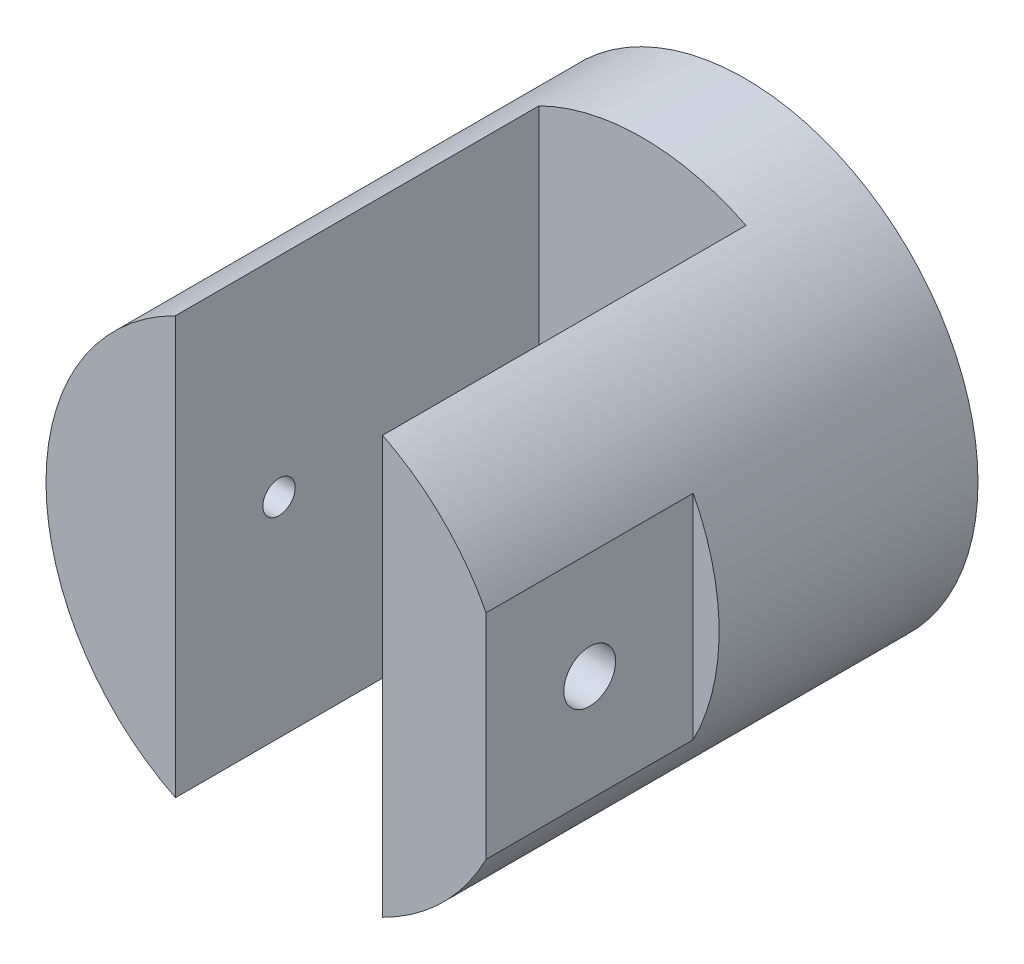
ISO-10303-21;
HEADER;
FILE_DESCRIPTION(('STEP AP214'),'2;1');
FILE_NAME('part.step','',(''),(''),'','','');
FILE_SCHEMA(('AUTOMOTIVE_DESIGN { 1 0 10303 214 1 1 1 1 }'));
ENDSEC;
DATA;
#1=APPLICATION_CONTEXT('core data for automotive mechanical design processes');
#2=APPLICATION_PROTOCOL_DEFINITION('international standard','automotive_design',2000,#1);
#3=PRODUCT_CONTEXT('',#1,'mechanical');
#4=PRODUCT('Part','Part','',(#3));
#5=PRODUCT_RELATED_PRODUCT_CATEGORY('part','',(#4));
#6=PRODUCT_DEFINITION_FORMATION('','',#4);
#7=PRODUCT_DEFINITION_CONTEXT('part definition',#1,'design');
#8=PRODUCT_DEFINITION('design','',#6,#7);
#9=PRODUCT_DEFINITION_SHAPE('','',#8);
#10=(LENGTH_UNIT() NAMED_UNIT(*) SI_UNIT(.MILLI.,.METRE.));
#11=(NAMED_UNIT(*) PLANE_ANGLE_UNIT() SI_UNIT($,.RADIAN.));
#12=(NAMED_UNIT(*) SI_UNIT($,.STERADIAN.) SOLID_ANGLE_UNIT());
#13=UNCERTAINTY_MEASURE_WITH_UNIT(LENGTH_MEASURE(1.E-05),#10,'distance_accuracy_value','');
#14=(GEOMETRIC_REPRESENTATION_CONTEXT(3) GLOBAL_UNCERTAINTY_ASSIGNED_CONTEXT((#13)) GLOBAL_UNIT_ASSIGNED_CONTEXT((#10,
#11,#12)) REPRESENTATION_CONTEXT('',''));
#15=CARTESIAN_POINT('',(0.,0.,0.));
#16=DIRECTION('',(0.,0.,1.));
#17=DIRECTION('',(1.,0.,0.));
#18=AXIS2_PLACEMENT_3D('',#15,#16,#17);
#19=CARTESIAN_POINT('',(0.,0.,57.15));
#20=DIRECTION('',(0.,0.,1.));
#21=DIRECTION('',(1.,0.,0.));
#22=AXIS2_PLACEMENT_3D('',#19,#20,#21);
#23=PLANE('',#22);
#24=CARTESIAN_POINT('',(0.,0.,57.15));
#25=DIRECTION('',(0.,0.,1.));
#26=DIRECTION('',(1.,0.,0.));
#27=AXIS2_PLACEMENT_3D('',#24,#25,#26);
#28=CIRCLE('',#27,28.575);
#29=CARTESIAN_POINT('',(12.7,-25.5976683508479,57.15));
#30=VERTEX_POINT('',#29);
#31=CARTESIAN_POINT('',(25.4,-13.0908603613361,57.15));
#32=VERTEX_POINT('',#31);
#33=EDGE_CURVE('E99',#30,#32,#28,.T.);
#34=ORIENTED_EDGE('',*,*,#33,.T.);
#35=DIRECTION('',(0.,1.,0.));
#36=VECTOR('',#35,1.);
#37=CARTESIAN_POINT('',(25.4,-25.5976683508479,57.15));
#38=LINE('',#37,#36);
#39=CARTESIAN_POINT('',(25.4,13.0908603613361,57.15));
#40=VERTEX_POINT('',#39);
#41=EDGE_CURVE('E86',#32,#40,#38,.T.);
#42=ORIENTED_EDGE('',*,*,#41,.T.);
#43=CARTESIAN_POINT('',(12.7,25.5976683508479,57.15));
#44=VERTEX_POINT('',#43);
#45=EDGE_CURVE('E105',#40,#44,#28,.T.);
#46=ORIENTED_EDGE('',*,*,#45,.T.);
#47=DIRECTION('',(0.,1.,0.));
#48=VECTOR('',#47,1.);
#49=CARTESIAN_POINT('',(12.7,0.,57.15));
#50=LINE('',#49,#48);
#51=EDGE_CURVE('E103',#30,#44,#50,.T.);
#52=ORIENTED_EDGE('',*,*,#51,.F.);
#53=EDGE_LOOP('',(#34,#42,#46,#52));
#54=FACE_BOUND('',#53,.T.);
#55=ADVANCED_FACE('F34',(#54),#23,.T.);
#56=CARTESIAN_POINT('',(0.,0.,57.15));
#57=DIRECTION('',(0.,0.,-1.));
#58=DIRECTION('',(-1.,0.,0.));
#59=AXIS2_PLACEMENT_3D('',#56,#57,#58);
#60=CYLINDRICAL_SURFACE('',#59,28.575);
#61=CARTESIAN_POINT('',(-28.575,0.,42.465625));
#62=CARTESIAN_POINT('',(-28.574999087953,0.111319299507645,42.4656298877848));
#63=CARTESIAN_POINT('',(-28.574342551963,0.222715892217428,42.4750236571586));
#64=CARTESIAN_POINT('',(-28.5717866196945,0.442431292671023,42.5123613819981));
#65=CARTESIAN_POINT('',(-28.5698857884811,0.550746396142106,42.5403267549819));
#66=CARTESIAN_POINT('',(-28.5650562309021,0.761084554485153,42.6139989227208));
#67=CARTESIAN_POINT('',(-28.5621280587557,0.863110967093981,42.6596961530836));
#68=CARTESIAN_POINT('',(-28.5555728670619,1.05801915420526,42.7675188522542));
#69=CARTESIAN_POINT('',(-28.551946004417,1.15090297476537,42.8296406338216));
#70=CARTESIAN_POINT('',(-28.5443935353041,1.32508394520094,42.9686718635007));
#71=CARTESIAN_POINT('',(-28.540467458915,1.40636226830162,43.0456048746165));
#72=CARTESIAN_POINT('',(-28.5327630432362,1.55486383992128,43.2120256397658));
#73=CARTESIAN_POINT('',(-28.5289847102184,1.62208649227941,43.3015139260531));
#74=CARTESIAN_POINT('',(-28.5219981541791,1.7406288148697,43.4906145557175));
#75=CARTESIAN_POINT('',(-28.5187905060806,1.79193248617025,43.5902369514768));
#76=CARTESIAN_POINT('',(-28.5133132635222,1.87707822897832,43.7967075523057));
#77=CARTESIAN_POINT('',(-28.5110436570288,1.91092052448609,43.9035556646615));
#78=CARTESIAN_POINT('',(-28.5077030009998,1.96012965963794,44.1212603160706));
#79=CARTESIAN_POINT('',(-28.506630007008,1.97552647561386,44.2321100490668));
#80=CARTESIAN_POINT('',(-28.5057977607184,1.98750015203671,44.4548253808133));
#81=CARTESIAN_POINT('',(-28.5060384905973,1.98407726780781,44.5666909657611));
#82=CARTESIAN_POINT('',(-28.5078047405347,1.95853354607668,44.7880579421178));
#83=CARTESIAN_POINT('',(-28.5093280288421,1.93644518769991,44.8975631016054));
#84=CARTESIAN_POINT('',(-28.5134842307626,1.87424792821694,45.1113077379459));
#85=CARTESIAN_POINT('',(-28.5161171522939,1.8341388985155,45.2155471772168));
#86=CARTESIAN_POINT('',(-28.5221984940563,1.73700212480837,45.415905497171));
#87=CARTESIAN_POINT('',(-28.5256476215771,1.67995969606262,45.5120172361306));
#88=CARTESIAN_POINT('',(-28.5329720138736,1.55058597118954,45.6933138147834));
#89=CARTESIAN_POINT('',(-28.5368472845997,1.47825446156546,45.7784985018646));
#90=CARTESIAN_POINT('',(-28.544597188435,1.32017310339922,45.9357118280196));
#91=CARTESIAN_POINT('',(-28.5484718028046,1.23439515545463,46.007712216499));
#92=CARTESIAN_POINT('',(-28.5557759079867,1.05195420334755,46.1362950541471));
#93=CARTESIAN_POINT('',(-28.559205398607,0.955291194485443,46.192877496659));
#94=CARTESIAN_POINT('',(-28.5652331981767,0.753806520907827,46.2890160754282));
#95=CARTESIAN_POINT('',(-28.5678314522194,0.648984317811049,46.3285710870105));
#96=CARTESIAN_POINT('',(-28.5719033065064,0.434164658178538,46.389512837987));
#97=CARTESIAN_POINT('',(-28.5733769229605,0.324167276258219,46.4108998392419));
#98=CARTESIAN_POINT('',(-28.5750313709088,0.102364718092508,46.4348633408994));
#99=CARTESIAN_POINT('',(-28.5752148860092,-0.00943622030672792,46.4374788890049));
#100=CARTESIAN_POINT('',(-28.5742755997621,-0.231887663287669,46.4239273443557));
#101=CARTESIAN_POINT('',(-28.5731528068323,-0.342538175278037,46.4077603726347));
#102=CARTESIAN_POINT('',(-28.5697289900858,-0.559437401378969,46.3571350506591));
#103=CARTESIAN_POINT('',(-28.5674291239248,-0.665690329757746,46.322694671147));
#104=CARTESIAN_POINT('',(-28.5619097845244,-0.87090847491883,46.2365184513664));
#105=CARTESIAN_POINT('',(-28.5586903010998,-0.969873610970421,46.1847824195399));
#106=CARTESIAN_POINT('',(-28.5516865290548,-1.15788539449078,46.065384473408));
#107=CARTESIAN_POINT('',(-28.5479013215336,-1.2469154858185,45.997696543437));
#108=CARTESIAN_POINT('',(-28.5401949613887,-1.41236313815245,45.8483539928909));
#109=CARTESIAN_POINT('',(-28.5362738071205,-1.48878054652832,45.7666992033225));
#110=CARTESIAN_POINT('',(-28.5287296627141,-1.62696640272635,45.5915720482555));
#111=CARTESIAN_POINT('',(-28.5251071960819,-1.68870947308748,45.498079632774));
#112=CARTESIAN_POINT('',(-28.5185773462006,-1.79562028380937,45.3020316028401));
#113=CARTESIAN_POINT('',(-28.5156699577079,-1.84078814571672,45.1994760548547));
#114=CARTESIAN_POINT('',(-28.5109019440666,-1.91322265822302,44.9883047713957));
#115=CARTESIAN_POINT('',(-28.5090403928892,-1.94050514887296,44.8796944910196));
#116=CARTESIAN_POINT('',(-28.506571438514,-1.97644615433683,44.6594213441718));
#117=CARTESIAN_POINT('',(-28.5059640193778,-1.98510490583367,44.5477585165121));
#118=CARTESIAN_POINT('',(-28.5060722212008,-1.98355024488174,44.3248022428108));
#119=CARTESIAN_POINT('',(-28.5067850458043,-1.97337672035081,44.2135085150856));
#120=CARTESIAN_POINT('',(-28.509447483139,-1.93452914122231,43.9942138386027));
#121=CARTESIAN_POINT('',(-28.5113970980188,-1.90585505448336,43.8862128955658));
#122=CARTESIAN_POINT('',(-28.5163127220648,-1.83082966284671,43.6765646525717));
#123=CARTESIAN_POINT('',(-28.5192787110915,-1.78447870821198,43.5749172267675));
#124=CARTESIAN_POINT('',(-28.5258928497638,-1.67542036739642,43.3808412889753));
#125=CARTESIAN_POINT('',(-28.5295409838508,-1.61271335425529,43.2884125667988));
#126=CARTESIAN_POINT('',(-28.5371174121709,-1.47257422976607,43.1151946079687));
#127=CARTESIAN_POINT('',(-28.5410462512,-1.39511296983274,43.0344289778683));
#128=CARTESIAN_POINT('',(-28.5487365746652,-1.22770934371807,42.8870177367506));
#129=CARTESIAN_POINT('',(-28.5524980180627,-1.13776393894668,42.8203755733364));
#130=CARTESIAN_POINT('',(-28.559434468147,-0.947821756099757,42.7030419960044));
#131=CARTESIAN_POINT('',(-28.5626086330706,-0.847810862841548,42.6523734054108));
#132=CARTESIAN_POINT('',(-28.5680021177587,-0.640750638508975,42.5686102494963));
#133=CARTESIAN_POINT('',(-28.5702225490045,-0.533709669007892,42.5354952166582));
#134=CARTESIAN_POINT('',(-28.5728800673192,-0.355017261798307,42.4963340243912));
#135=CARTESIAN_POINT('',(-28.5736714832197,-0.284519210892245,42.4848331555658));
#136=CARTESIAN_POINT('',(-28.5747317414387,-0.142691360205758,42.4694770833858));
#137=CARTESIAN_POINT('',(-28.5750005846704,-0.0713615618789448,42.4656218666713));
#138=CARTESIAN_POINT('',(-28.575,0.,42.465625));
#139=B_SPLINE_CURVE_WITH_KNOTS('',3,(#61,#62,#63,#64,#65,#66,#67,#68,#69,#70,#71,#72,#73,#74,
#75,#76,#77,#78,#79,#80,#81,#82,#83,#84,#85,#86,#87,#88,#89,#90,#91,#92,#93,#94,#95,#96,#97,#98,
#99,#100,#101,#102,#103,#104,#105,#106,#107,#108,#109,#110,#111,#112,#113,#114,#115,#116,#117,
#118,#119,#120,#121,#122,#123,#124,#125,#126,#127,#128,#129,#130,#131,#132,#133,#134,#135,#136,
#137,#138),.UNSPECIFIED.,.T.,.F.,(4,2,2,2,2,2,2,2,2,2,2,2,2,2,2,2,2,2,2,2,2,2,2,2,2,2,2,2,2,2,2,
2,2,2,2,2,2,2,4),(0.,0.333697375898876,0.667780254837741,1.00168318263904,1.33551121424018,
1.6698747841483,2.0042525329636,2.33896525847292,2.67367369007098,3.00783743532058,
3.34199664702969,3.67557559469445,4.00915692281119,4.34302838386973,4.67690450741815,
5.01148787823042,5.3460713934992,5.68067700487739,6.01527779340976,6.34918235512075,
6.68308476517682,7.01665941028769,7.35023775002504,7.68436392818889,8.01849414943063,
8.35319807025538,8.68789953663544,9.02230417515375,9.35670456380953,9.69039748217925,
10.0240909802814,10.357777866669,10.6914571431809,11.0258026075465,11.3602295934113,
11.6951322712522,12.029643587471,12.2435616381192,12.4574793149674),.UNSPECIFIED.);
#140=CARTESIAN_POINT('',(-28.575,0.,42.465625));
#141=VERTEX_POINT('',#140);
#142=EDGE_CURVE('E188',#141,#141,#139,.T.);
#143=ORIENTED_EDGE('',*,*,#142,.T.);
#144=EDGE_LOOP('',(#143));
#145=FACE_BOUND('',#144,.T.);
#146=CARTESIAN_POINT('',(0.,0.,0.));
#147=DIRECTION('',(0.,0.,1.));
#148=DIRECTION('',(1.,0.,0.));
#149=AXIS2_PLACEMENT_3D('',#146,#147,#148);
#150=CIRCLE('',#149,28.575);
#151=CARTESIAN_POINT('',(28.575,0.,0.));
#152=VERTEX_POINT('',#151);
#153=EDGE_CURVE('E108',#152,#152,#150,.T.);
#154=ORIENTED_EDGE('',*,*,#153,.T.);
#155=EDGE_LOOP('',(#154));
#156=FACE_BOUND('',#155,.T.);
#157=DIRECTION('',(0.,0.,-1.));
#158=VECTOR('',#157,1.);
#159=CARTESIAN_POINT('',(25.4,-13.0908603613361,57.15));
#160=LINE('',#159,#158);
#161=CARTESIAN_POINT('',(25.4,-13.0908603613361,31.75));
#162=VERTEX_POINT('',#161);
#163=EDGE_CURVE('E13',#32,#162,#160,.T.);
#164=ORIENTED_EDGE('',*,*,#163,.F.);
#165=ORIENTED_EDGE('',*,*,#33,.F.);
#166=DIRECTION('',(0.,0.,-1.));
#167=VECTOR('',#166,1.);
#168=CARTESIAN_POINT('',(12.7,-25.5976683508479,57.15));
#169=LINE('',#168,#167);
#170=CARTESIAN_POINT('',(12.7,-25.5976683508479,12.573));
#171=VERTEX_POINT('',#170);
#172=EDGE_CURVE('E111',#30,#171,#169,.T.);
#173=ORIENTED_EDGE('',*,*,#172,.T.);
#174=CARTESIAN_POINT('',(0.,0.,12.573));
#175=DIRECTION('',(0.,0.,-1.));
#176=DIRECTION('',(-1.,0.,0.));
#177=AXIS2_PLACEMENT_3D('',#174,#175,#176);
#178=CIRCLE('',#177,28.575);
#179=CARTESIAN_POINT('',(-12.7,-25.5976683508479,12.573));
#180=VERTEX_POINT('',#179);
#181=EDGE_CURVE('E117',#171,#180,#178,.T.);
#182=ORIENTED_EDGE('',*,*,#181,.T.);
#183=DIRECTION('',(0.,0.,-1.));
#184=VECTOR('',#183,1.);
#185=CARTESIAN_POINT('',(-12.7,-25.5976683508479,57.15));
#186=LINE('',#185,#184);
#187=CARTESIAN_POINT('',(-12.7,-25.5976683508479,57.15));
#188=VERTEX_POINT('',#187);
#189=EDGE_CURVE('E134',#180,#188,#186,.F.);
#190=ORIENTED_EDGE('',*,*,#189,.T.);
#191=CARTESIAN_POINT('',(-12.7,25.5976683508479,57.15));
#192=VERTEX_POINT('',#191);
#193=EDGE_CURVE('E104',#192,#188,#28,.T.);
#194=ORIENTED_EDGE('',*,*,#193,.F.);
#195=DIRECTION('',(0.,0.,-1.));
#196=VECTOR('',#195,1.);
#197=CARTESIAN_POINT('',(-12.7,25.5976683508479,57.15));
#198=LINE('',#197,#196);
#199=CARTESIAN_POINT('',(-12.7,25.5976683508479,12.573));
#200=VERTEX_POINT('',#199);
#201=EDGE_CURVE('E57',#192,#200,#198,.T.);
#202=ORIENTED_EDGE('',*,*,#201,.T.);
#203=CARTESIAN_POINT('',(12.7,25.5976683508479,12.573));
#204=VERTEX_POINT('',#203);
#205=EDGE_CURVE('E119',#200,#204,#178,.T.);
#206=ORIENTED_EDGE('',*,*,#205,.T.);
#207=DIRECTION('',(0.,0.,-1.));
#208=VECTOR('',#207,1.);
#209=CARTESIAN_POINT('',(12.7,25.5976683508479,57.15));
#210=LINE('',#209,#208);
#211=EDGE_CURVE('E122',#204,#44,#210,.F.);
#212=ORIENTED_EDGE('',*,*,#211,.T.);
#213=ORIENTED_EDGE('',*,*,#45,.F.);
#214=DIRECTION('',(0.,0.,-1.));
#215=VECTOR('',#214,1.);
#216=CARTESIAN_POINT('',(25.4,13.0908603613361,57.15));
#217=LINE('',#216,#215);
#218=CARTESIAN_POINT('',(25.4,13.0908603613361,31.75));
#219=VERTEX_POINT('',#218);
#220=EDGE_CURVE('E43',#219,#40,#217,.F.);
#221=ORIENTED_EDGE('',*,*,#220,.F.);
#222=CARTESIAN_POINT('',(0.,0.,31.75));
#223=DIRECTION('',(0.,0.,1.));
#224=DIRECTION('',(1.,0.,0.));
#225=AXIS2_PLACEMENT_3D('',#222,#223,#224);
#226=CIRCLE('',#225,28.575);
#227=EDGE_CURVE('E100',#162,#219,#226,.T.);
#228=ORIENTED_EDGE('',*,*,#227,.F.);
#229=EDGE_LOOP('',(#164,#165,#173,#182,#190,#194,#202,#206,#212,#213,#221,#228));
#230=FACE_BOUND('',#229,.T.);
#231=ADVANCED_FACE('F36',(#145,#156,#230),#60,.T.);
#232=DIRECTION('',(0.,-1.,0.));
#233=VECTOR('',#232,1.);
#234=CARTESIAN_POINT('',(-12.7,0.,57.15));
#235=LINE('',#234,#233);
#236=EDGE_CURVE('E107',#192,#188,#235,.T.);
#237=ORIENTED_EDGE('',*,*,#236,.F.);
#238=ORIENTED_EDGE('',*,*,#193,.T.);
#239=EDGE_LOOP('',(#237,#238));
#240=FACE_BOUND('',#239,.T.);
#241=ADVANCED_FACE('F161',(#240),#23,.T.);
#242=CARTESIAN_POINT('',(0.,0.,0.));
#243=DIRECTION('',(0.,0.,1.));
#244=DIRECTION('',(1.,0.,0.));
#245=AXIS2_PLACEMENT_3D('',#242,#243,#244);
#246=PLANE('',#245);
#247=CARTESIAN_POINT('',(0.,0.,0.));
#248=DIRECTION('',(0.,0.,1.));
#249=DIRECTION('',(1.,0.,0.));
#250=AXIS2_PLACEMENT_3D('',#247,#248,#249);
#251=CIRCLE('',#250,7.9375);
#252=CARTESIAN_POINT('',(7.9375,0.,0.));
#253=VERTEX_POINT('',#252);
#254=EDGE_CURVE('E137',#253,#253,#251,.T.);
#255=ORIENTED_EDGE('',*,*,#254,.T.);
#256=EDGE_LOOP('',(#255));
#257=FACE_BOUND('',#256,.T.);
#258=ORIENTED_EDGE('',*,*,#153,.F.);
#259=EDGE_LOOP('',(#258));
#260=FACE_BOUND('',#259,.T.);
#261=ADVANCED_FACE('F155',(#257,#260),#246,.F.);
#262=CARTESIAN_POINT('',(-12.7,-50.8,12.573));
#263=DIRECTION('',(0.,0.,-1.));
#264=DIRECTION('',(-1.,0.,0.));
#265=AXIS2_PLACEMENT_3D('',#262,#263,#264);
#266=PLANE('',#265);
#267=CARTESIAN_POINT('',(0.,0.,12.573));
#268=DIRECTION('',(0.,0.,1.));
#269=DIRECTION('',(1.,0.,0.));
#270=AXIS2_PLACEMENT_3D('',#267,#268,#269);
#271=CIRCLE('',#270,7.9375);
#272=CARTESIAN_POINT('',(7.9375,0.,12.573));
#273=VERTEX_POINT('',#272);
#274=EDGE_CURVE('E140',#273,#273,#271,.T.);
#275=ORIENTED_EDGE('',*,*,#274,.F.);
#276=EDGE_LOOP('',(#275));
#277=FACE_BOUND('',#276,.T.);
#278=DIRECTION('',(0.,1.,0.));
#279=VECTOR('',#278,1.);
#280=CARTESIAN_POINT('',(-12.7,-50.8,12.573));
#281=LINE('',#280,#279);
#282=EDGE_CURVE('E129',#180,#200,#281,.T.);
#283=ORIENTED_EDGE('',*,*,#282,.F.);
#284=ORIENTED_EDGE('',*,*,#181,.F.);
#285=DIRECTION('',(0.,1.,0.));
#286=VECTOR('',#285,1.);
#287=CARTESIAN_POINT('',(12.7,-50.8,12.573));
#288=LINE('',#287,#286);
#289=EDGE_CURVE('E131',#171,#204,#288,.T.);
#290=ORIENTED_EDGE('',*,*,#289,.T.);
#291=ORIENTED_EDGE('',*,*,#205,.F.);
#292=EDGE_LOOP('',(#283,#284,#290,#291));
#293=FACE_BOUND('',#292,.T.);
#294=ADVANCED_FACE('F127',(#277,#293),#266,.F.);
#295=CARTESIAN_POINT('',(12.7,-50.8,12.573));
#296=DIRECTION('',(1.,0.,0.));
#297=DIRECTION('',(0.,0.,-1.));
#298=AXIS2_PLACEMENT_3D('',#295,#296,#297);
#299=PLANE('',#298);
#300=CARTESIAN_POINT('',(12.7,0.,44.45));
#301=DIRECTION('',(1.,0.,0.));
#302=DIRECTION('',(0.,0.,-1.));
#303=AXIS2_PLACEMENT_3D('',#300,#301,#302);
#304=CIRCLE('',#303,3.175);
#305=CARTESIAN_POINT('',(12.7,0.,41.275));
#306=VERTEX_POINT('',#305);
#307=EDGE_CURVE('E94',#306,#306,#304,.T.);
#308=ORIENTED_EDGE('',*,*,#307,.T.);
#309=EDGE_LOOP('',(#308));
#310=FACE_BOUND('',#309,.T.);
#311=ORIENTED_EDGE('',*,*,#51,.T.);
#312=ORIENTED_EDGE('',*,*,#211,.F.);
#313=ORIENTED_EDGE('',*,*,#289,.F.);
#314=ORIENTED_EDGE('',*,*,#172,.F.);
#315=EDGE_LOOP('',(#311,#312,#313,#314));
#316=FACE_BOUND('',#315,.T.);
#317=ADVANCED_FACE('F144',(#310,#316),#299,.F.);
#318=CARTESIAN_POINT('',(-12.7,-50.8,12.573));
#319=DIRECTION('',(-1.,0.,0.));
#320=DIRECTION('',(0.,0.,1.));
#321=AXIS2_PLACEMENT_3D('',#318,#319,#320);
#322=PLANE('',#321);
#323=CARTESIAN_POINT('',(-12.7,0.,44.45));
#324=DIRECTION('',(1.,0.,0.));
#325=DIRECTION('',(0.,0.,-1.));
#326=AXIS2_PLACEMENT_3D('',#323,#324,#325);
#327=CIRCLE('',#326,1.984375);
#328=CARTESIAN_POINT('',(-12.7,0.,42.465625));
#329=VERTEX_POINT('',#328);
#330=EDGE_CURVE('E195',#329,#329,#327,.T.);
#331=ORIENTED_EDGE('',*,*,#330,.F.);
#332=EDGE_LOOP('',(#331));
#333=FACE_BOUND('',#332,.T.);
#334=ORIENTED_EDGE('',*,*,#236,.T.);
#335=ORIENTED_EDGE('',*,*,#189,.F.);
#336=ORIENTED_EDGE('',*,*,#282,.T.);
#337=ORIENTED_EDGE('',*,*,#201,.F.);
#338=EDGE_LOOP('',(#334,#335,#336,#337));
#339=FACE_BOUND('',#338,.T.);
#340=ADVANCED_FACE('F132',(#333,#339),#322,.F.);
#341=CARTESIAN_POINT('',(0.,0.,0.));
#342=DIRECTION('',(0.,0.,1.));
#343=DIRECTION('',(1.,0.,0.));
#344=AXIS2_PLACEMENT_3D('',#341,#342,#343);
#345=CYLINDRICAL_SURFACE('',#344,7.9375);
#346=ORIENTED_EDGE('',*,*,#254,.F.);
#347=EDGE_LOOP('',(#346));
#348=FACE_BOUND('',#347,.T.);
#349=ORIENTED_EDGE('',*,*,#274,.T.);
#350=EDGE_LOOP('',(#349));
#351=FACE_BOUND('',#350,.T.);
#352=ADVANCED_FACE('F152',(#348,#351),#345,.F.);
#353=CARTESIAN_POINT('',(25.4,-25.5976683508479,31.75));
#354=DIRECTION('',(1.,0.,0.));
#355=DIRECTION('',(0.,0.,-1.));
#356=AXIS2_PLACEMENT_3D('',#353,#354,#355);
#357=PLANE('',#356);
#358=CARTESIAN_POINT('',(25.4,0.,44.45));
#359=DIRECTION('',(1.,0.,0.));
#360=DIRECTION('',(0.,0.,-1.));
#361=AXIS2_PLACEMENT_3D('',#358,#359,#360);
#362=CIRCLE('',#361,3.175);
#363=CARTESIAN_POINT('',(25.4,0.,41.275));
#364=VERTEX_POINT('',#363);
#365=EDGE_CURVE('E185',#364,#364,#362,.T.);
#366=ORIENTED_EDGE('',*,*,#365,.F.);
#367=EDGE_LOOP('',(#366));
#368=FACE_BOUND('',#367,.T.);
#369=ORIENTED_EDGE('',*,*,#163,.T.);
#370=DIRECTION('',(0.,1.,0.));
#371=VECTOR('',#370,1.);
#372=CARTESIAN_POINT('',(25.4,-25.5976683508479,31.75));
#373=LINE('',#372,#371);
#374=EDGE_CURVE('E49',#162,#219,#373,.T.);
#375=ORIENTED_EDGE('',*,*,#374,.T.);
#376=ORIENTED_EDGE('',*,*,#220,.T.);
#377=ORIENTED_EDGE('',*,*,#41,.F.);
#378=EDGE_LOOP('',(#369,#375,#376,#377));
#379=FACE_BOUND('',#378,.T.);
#380=ADVANCED_FACE('F88',(#368,#379),#357,.T.);
#381=CARTESIAN_POINT('',(0.,0.,31.75));
#382=DIRECTION('',(0.,0.,1.));
#383=DIRECTION('',(1.,0.,0.));
#384=AXIS2_PLACEMENT_3D('',#381,#382,#383);
#385=PLANE('',#384);
#386=ORIENTED_EDGE('',*,*,#227,.T.);
#387=ORIENTED_EDGE('',*,*,#374,.F.);
#388=EDGE_LOOP('',(#386,#387));
#389=FACE_BOUND('',#388,.T.);
#390=ADVANCED_FACE('F204',(#389),#385,.T.);
#391=CARTESIAN_POINT('',(-21.6802561210691,0.,44.45));
#392=DIRECTION('',(1.,0.,0.));
#393=DIRECTION('',(0.,0.,-1.));
#394=AXIS2_PLACEMENT_3D('',#391,#392,#393);
#395=CYLINDRICAL_SURFACE('',#394,3.175);
#396=ORIENTED_EDGE('',*,*,#365,.T.);
#397=EDGE_LOOP('',(#396));
#398=FACE_BOUND('',#397,.T.);
#399=ORIENTED_EDGE('',*,*,#307,.F.);
#400=EDGE_LOOP('',(#399));
#401=FACE_BOUND('',#400,.T.);
#402=ADVANCED_FACE('F200',(#398,#401),#395,.F.);
#403=CARTESIAN_POINT('',(-28.575,0.,44.45));
#404=DIRECTION('',(1.,0.,0.));
#405=DIRECTION('',(0.,0.,-1.));
#406=AXIS2_PLACEMENT_3D('',#403,#404,#405);
#407=CYLINDRICAL_SURFACE('',#406,1.984375);
#408=ORIENTED_EDGE('',*,*,#330,.T.);
#409=EDGE_LOOP('',(#408));
#410=FACE_BOUND('',#409,.T.);
#411=ORIENTED_EDGE('',*,*,#142,.F.);
#412=EDGE_LOOP('',(#411));
#413=FACE_BOUND('',#412,.T.);
#414=ADVANCED_FACE('F196',(#410,#413),#407,.F.);
#415=CLOSED_SHELL('',(#55,#231,#241,#261,#294,#317,#340,#352,#380,#390,#402,#414));
#416=MANIFOLD_SOLID_BREP('B2',#415);
#417=ADVANCED_BREP_SHAPE_REPRESENTATION('',(#18,#416),#14);
#418=SHAPE_DEFINITION_REPRESENTATION(#9,#417);
ENDSEC;
END-ISO-10303-21;
